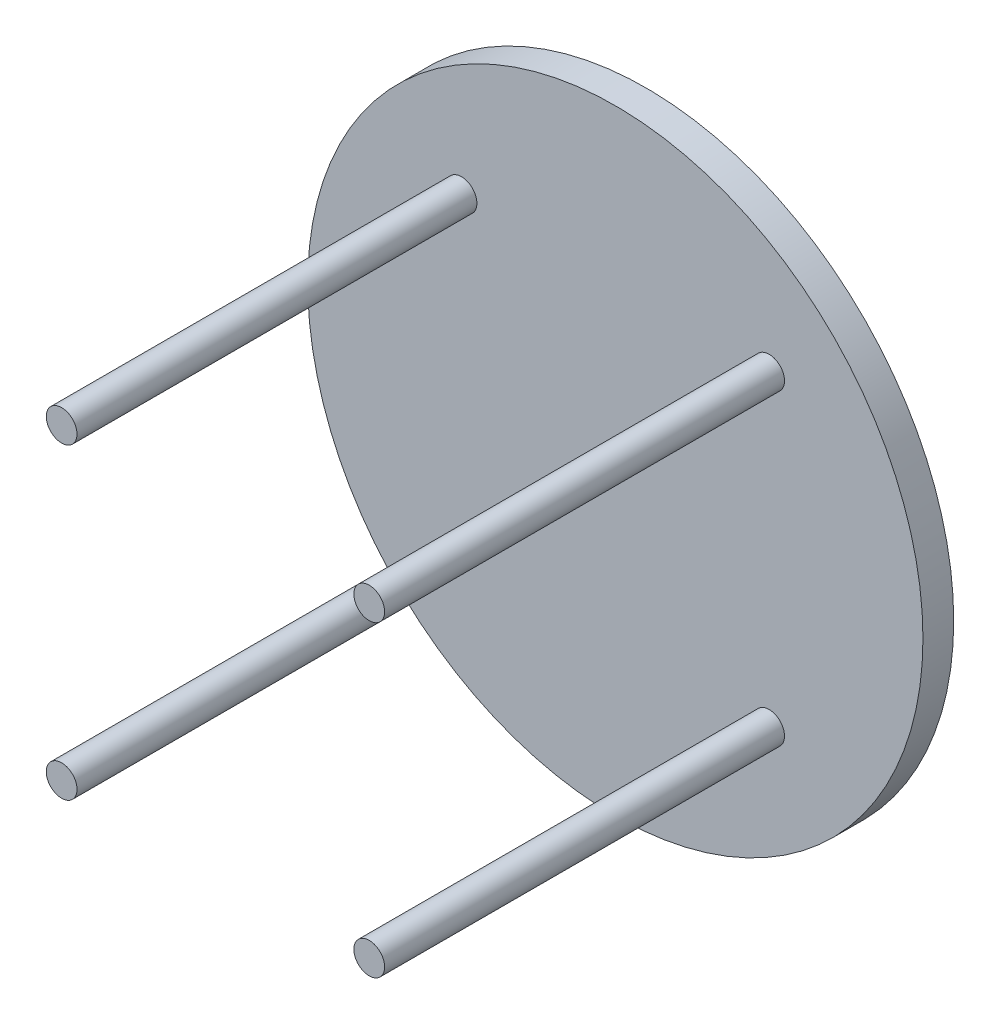
ISO-10303-21;
HEADER;
FILE_DESCRIPTION(('STEP AP214'),'2;1');
FILE_NAME('part.step','',(''),(''),'','','');
FILE_SCHEMA(('AUTOMOTIVE_DESIGN { 1 0 10303 214 1 1 1 1 }'));
ENDSEC;
DATA;
#1=APPLICATION_CONTEXT('core data for automotive mechanical design processes');
#2=APPLICATION_PROTOCOL_DEFINITION('international standard','automotive_design',2000,#1);
#3=PRODUCT_CONTEXT('',#1,'mechanical');
#4=PRODUCT('Part','Part','',(#3));
#5=PRODUCT_RELATED_PRODUCT_CATEGORY('part','',(#4));
#6=PRODUCT_DEFINITION_FORMATION('','',#4);
#7=PRODUCT_DEFINITION_CONTEXT('part definition',#1,'design');
#8=PRODUCT_DEFINITION('design','',#6,#7);
#9=PRODUCT_DEFINITION_SHAPE('','',#8);
#10=(LENGTH_UNIT() NAMED_UNIT(*) SI_UNIT(.MILLI.,.METRE.));
#11=(NAMED_UNIT(*) PLANE_ANGLE_UNIT() SI_UNIT($,.RADIAN.));
#12=(NAMED_UNIT(*) SI_UNIT($,.STERADIAN.) SOLID_ANGLE_UNIT());
#13=UNCERTAINTY_MEASURE_WITH_UNIT(LENGTH_MEASURE(1.E-05),#10,'distance_accuracy_value','');
#14=(GEOMETRIC_REPRESENTATION_CONTEXT(3) GLOBAL_UNCERTAINTY_ASSIGNED_CONTEXT((#13)) GLOBAL_UNIT_ASSIGNED_CONTEXT((#10,
#11,#12)) REPRESENTATION_CONTEXT('',''));
#15=CARTESIAN_POINT('',(0.,0.,0.));
#16=DIRECTION('',(0.,0.,1.));
#17=DIRECTION('',(1.,0.,0.));
#18=AXIS2_PLACEMENT_3D('',#15,#16,#17);
#19=CARTESIAN_POINT('',(0.,0.,50.));
#20=DIRECTION('',(0.,0.,-1.));
#21=DIRECTION('',(-1.,0.,0.));
#22=AXIS2_PLACEMENT_3D('',#19,#20,#21);
#23=CYLINDRICAL_SURFACE('',#22,500.);
#24=CARTESIAN_POINT('',(0.,0.,50.));
#25=DIRECTION('',(0.,0.,1.));
#26=DIRECTION('',(1.,0.,0.));
#27=AXIS2_PLACEMENT_3D('',#24,#25,#26);
#28=CIRCLE('',#27,500.);
#29=CARTESIAN_POINT('',(500.,0.,50.));
#30=VERTEX_POINT('',#29);
#31=EDGE_CURVE('E10',#30,#30,#28,.T.);
#32=ORIENTED_EDGE('',*,*,#31,.F.);
#33=EDGE_LOOP('',(#32));
#34=FACE_BOUND('',#33,.T.);
#35=CARTESIAN_POINT('',(0.,0.,0.));
#36=DIRECTION('',(0.,0.,1.));
#37=DIRECTION('',(1.,0.,0.));
#38=AXIS2_PLACEMENT_3D('',#35,#36,#37);
#39=CIRCLE('',#38,500.);
#40=CARTESIAN_POINT('',(500.,0.,0.));
#41=VERTEX_POINT('',#40);
#42=EDGE_CURVE('E42',#41,#41,#39,.T.);
#43=ORIENTED_EDGE('',*,*,#42,.T.);
#44=EDGE_LOOP('',(#43));
#45=FACE_BOUND('',#44,.T.);
#46=ADVANCED_FACE('F39',(#34,#45),#23,.T.);
#47=CARTESIAN_POINT('',(0.,0.,50.));
#48=DIRECTION('',(0.,0.,1.));
#49=DIRECTION('',(1.,0.,0.));
#50=AXIS2_PLACEMENT_3D('',#47,#48,#49);
#51=PLANE('',#50);
#52=CARTESIAN_POINT('',(-250.,-250.,50.));
#53=DIRECTION('',(0.,0.,1.));
#54=DIRECTION('',(1.,0.,0.));
#55=AXIS2_PLACEMENT_3D('',#52,#53,#54);
#56=CIRCLE('',#55,25.);
#57=CARTESIAN_POINT('',(-225.,-250.,50.));
#58=VERTEX_POINT('',#57);
#59=EDGE_CURVE('E68',#58,#58,#56,.F.);
#60=ORIENTED_EDGE('',*,*,#59,.T.);
#61=EDGE_LOOP('',(#60));
#62=FACE_BOUND('',#61,.T.);
#63=CARTESIAN_POINT('',(250.,-250.,50.));
#64=DIRECTION('',(0.,0.,1.));
#65=DIRECTION('',(1.,0.,0.));
#66=AXIS2_PLACEMENT_3D('',#63,#64,#65);
#67=CIRCLE('',#66,25.);
#68=CARTESIAN_POINT('',(275.,-250.,50.));
#69=VERTEX_POINT('',#68);
#70=EDGE_CURVE('E62',#69,#69,#67,.F.);
#71=ORIENTED_EDGE('',*,*,#70,.T.);
#72=EDGE_LOOP('',(#71));
#73=FACE_BOUND('',#72,.T.);
#74=CARTESIAN_POINT('',(-250.,250.,50.));
#75=DIRECTION('',(0.,0.,1.));
#76=DIRECTION('',(1.,0.,0.));
#77=AXIS2_PLACEMENT_3D('',#74,#75,#76);
#78=CIRCLE('',#77,25.);
#79=CARTESIAN_POINT('',(-225.,250.,50.));
#80=VERTEX_POINT('',#79);
#81=EDGE_CURVE('E56',#80,#80,#78,.F.);
#82=ORIENTED_EDGE('',*,*,#81,.T.);
#83=EDGE_LOOP('',(#82));
#84=FACE_BOUND('',#83,.T.);
#85=CARTESIAN_POINT('',(250.,250.,50.));
#86=DIRECTION('',(0.,0.,1.));
#87=DIRECTION('',(1.,0.,0.));
#88=AXIS2_PLACEMENT_3D('',#85,#86,#87);
#89=CIRCLE('',#88,25.);
#90=CARTESIAN_POINT('',(275.,250.,50.));
#91=VERTEX_POINT('',#90);
#92=EDGE_CURVE('E49',#91,#91,#89,.F.);
#93=ORIENTED_EDGE('',*,*,#92,.T.);
#94=EDGE_LOOP('',(#93));
#95=FACE_BOUND('',#94,.T.);
#96=ORIENTED_EDGE('',*,*,#31,.T.);
#97=EDGE_LOOP('',(#96));
#98=FACE_BOUND('',#97,.T.);
#99=ADVANCED_FACE('F93',(#62,#73,#84,#95,#98),#51,.T.);
#100=CARTESIAN_POINT('',(0.,0.,0.));
#101=DIRECTION('',(0.,0.,1.));
#102=DIRECTION('',(1.,0.,0.));
#103=AXIS2_PLACEMENT_3D('',#100,#101,#102);
#104=PLANE('',#103);
#105=ORIENTED_EDGE('',*,*,#42,.F.);
#106=EDGE_LOOP('',(#105));
#107=FACE_BOUND('',#106,.T.);
#108=ADVANCED_FACE('F99',(#107),#104,.F.);
#109=CARTESIAN_POINT('',(250.,250.,700.));
#110=DIRECTION('',(0.,0.,-1.));
#111=DIRECTION('',(-1.,0.,0.));
#112=AXIS2_PLACEMENT_3D('',#109,#110,#111);
#113=CYLINDRICAL_SURFACE('',#112,25.);
#114=ORIENTED_EDGE('',*,*,#92,.F.);
#115=EDGE_LOOP('',(#114));
#116=FACE_BOUND('',#115,.T.);
#117=CARTESIAN_POINT('',(250.,250.,700.));
#118=DIRECTION('',(0.,0.,1.));
#119=DIRECTION('',(1.,0.,0.));
#120=AXIS2_PLACEMENT_3D('',#117,#118,#119);
#121=CIRCLE('',#120,25.);
#122=CARTESIAN_POINT('',(275.,250.,700.));
#123=VERTEX_POINT('',#122);
#124=EDGE_CURVE('E53',#123,#123,#121,.T.);
#125=ORIENTED_EDGE('',*,*,#124,.F.);
#126=EDGE_LOOP('',(#125));
#127=FACE_BOUND('',#126,.T.);
#128=ADVANCED_FACE('F105',(#116,#127),#113,.T.);
#129=CARTESIAN_POINT('',(250.,250.,700.));
#130=DIRECTION('',(0.,0.,1.));
#131=DIRECTION('',(1.,0.,0.));
#132=AXIS2_PLACEMENT_3D('',#129,#130,#131);
#133=PLANE('',#132);
#134=ORIENTED_EDGE('',*,*,#124,.T.);
#135=EDGE_LOOP('',(#134));
#136=FACE_BOUND('',#135,.T.);
#137=ADVANCED_FACE('F108',(#136),#133,.T.);
#138=CARTESIAN_POINT('',(-250.,250.,700.));
#139=DIRECTION('',(0.,0.,-1.));
#140=DIRECTION('',(-1.,0.,0.));
#141=AXIS2_PLACEMENT_3D('',#138,#139,#140);
#142=CYLINDRICAL_SURFACE('',#141,25.);
#143=ORIENTED_EDGE('',*,*,#81,.F.);
#144=EDGE_LOOP('',(#143));
#145=FACE_BOUND('',#144,.T.);
#146=CARTESIAN_POINT('',(-250.,250.,700.));
#147=DIRECTION('',(0.,0.,1.));
#148=DIRECTION('',(1.,0.,0.));
#149=AXIS2_PLACEMENT_3D('',#146,#147,#148);
#150=CIRCLE('',#149,25.);
#151=CARTESIAN_POINT('',(-225.,250.,700.));
#152=VERTEX_POINT('',#151);
#153=EDGE_CURVE('E59',#152,#152,#150,.T.);
#154=ORIENTED_EDGE('',*,*,#153,.F.);
#155=EDGE_LOOP('',(#154));
#156=FACE_BOUND('',#155,.T.);
#157=ADVANCED_FACE('F114',(#145,#156),#142,.T.);
#158=CARTESIAN_POINT('',(-250.,250.,700.));
#159=DIRECTION('',(0.,0.,1.));
#160=DIRECTION('',(1.,0.,0.));
#161=AXIS2_PLACEMENT_3D('',#158,#159,#160);
#162=PLANE('',#161);
#163=ORIENTED_EDGE('',*,*,#153,.T.);
#164=EDGE_LOOP('',(#163));
#165=FACE_BOUND('',#164,.T.);
#166=ADVANCED_FACE('F118',(#165),#162,.T.);
#167=CARTESIAN_POINT('',(250.,-250.,700.));
#168=DIRECTION('',(0.,0.,-1.));
#169=DIRECTION('',(-1.,0.,0.));
#170=AXIS2_PLACEMENT_3D('',#167,#168,#169);
#171=CYLINDRICAL_SURFACE('',#170,25.);
#172=ORIENTED_EDGE('',*,*,#70,.F.);
#173=EDGE_LOOP('',(#172));
#174=FACE_BOUND('',#173,.T.);
#175=CARTESIAN_POINT('',(250.,-250.,700.));
#176=DIRECTION('',(0.,0.,1.));
#177=DIRECTION('',(1.,0.,0.));
#178=AXIS2_PLACEMENT_3D('',#175,#176,#177);
#179=CIRCLE('',#178,25.);
#180=CARTESIAN_POINT('',(275.,-250.,700.));
#181=VERTEX_POINT('',#180);
#182=EDGE_CURVE('E65',#181,#181,#179,.T.);
#183=ORIENTED_EDGE('',*,*,#182,.F.);
#184=EDGE_LOOP('',(#183));
#185=FACE_BOUND('',#184,.T.);
#186=ADVANCED_FACE('F88',(#174,#185),#171,.T.);
#187=CARTESIAN_POINT('',(250.,-250.,700.));
#188=DIRECTION('',(0.,0.,1.));
#189=DIRECTION('',(1.,0.,0.));
#190=AXIS2_PLACEMENT_3D('',#187,#188,#189);
#191=PLANE('',#190);
#192=ORIENTED_EDGE('',*,*,#182,.T.);
#193=EDGE_LOOP('',(#192));
#194=FACE_BOUND('',#193,.T.);
#195=ADVANCED_FACE('F79',(#194),#191,.T.);
#196=CARTESIAN_POINT('',(-250.,-250.,700.));
#197=DIRECTION('',(0.,0.,-1.));
#198=DIRECTION('',(-1.,0.,0.));
#199=AXIS2_PLACEMENT_3D('',#196,#197,#198);
#200=CYLINDRICAL_SURFACE('',#199,25.);
#201=ORIENTED_EDGE('',*,*,#59,.F.);
#202=EDGE_LOOP('',(#201));
#203=FACE_BOUND('',#202,.T.);
#204=CARTESIAN_POINT('',(-250.,-250.,700.));
#205=DIRECTION('',(0.,0.,1.));
#206=DIRECTION('',(1.,0.,0.));
#207=AXIS2_PLACEMENT_3D('',#204,#205,#206);
#208=CIRCLE('',#207,25.);
#209=CARTESIAN_POINT('',(-225.,-250.,700.));
#210=VERTEX_POINT('',#209);
#211=EDGE_CURVE('E71',#210,#210,#208,.T.);
#212=ORIENTED_EDGE('',*,*,#211,.F.);
#213=EDGE_LOOP('',(#212));
#214=FACE_BOUND('',#213,.T.);
#215=ADVANCED_FACE('F77',(#203,#214),#200,.T.);
#216=CARTESIAN_POINT('',(-250.,-250.,700.));
#217=DIRECTION('',(0.,0.,1.));
#218=DIRECTION('',(1.,0.,0.));
#219=AXIS2_PLACEMENT_3D('',#216,#217,#218);
#220=PLANE('',#219);
#221=ORIENTED_EDGE('',*,*,#211,.T.);
#222=EDGE_LOOP('',(#221));
#223=FACE_BOUND('',#222,.T.);
#224=ADVANCED_FACE('F75',(#223),#220,.T.);
#225=CLOSED_SHELL('',(#46,#99,#108,#128,#137,#157,#166,#186,#195,#215,#224));
#226=MANIFOLD_SOLID_BREP('B2',#225);
#227=ADVANCED_BREP_SHAPE_REPRESENTATION('',(#18,#226),#14);
#228=SHAPE_DEFINITION_REPRESENTATION(#9,#227);
ENDSEC;
END-ISO-10303-21;
